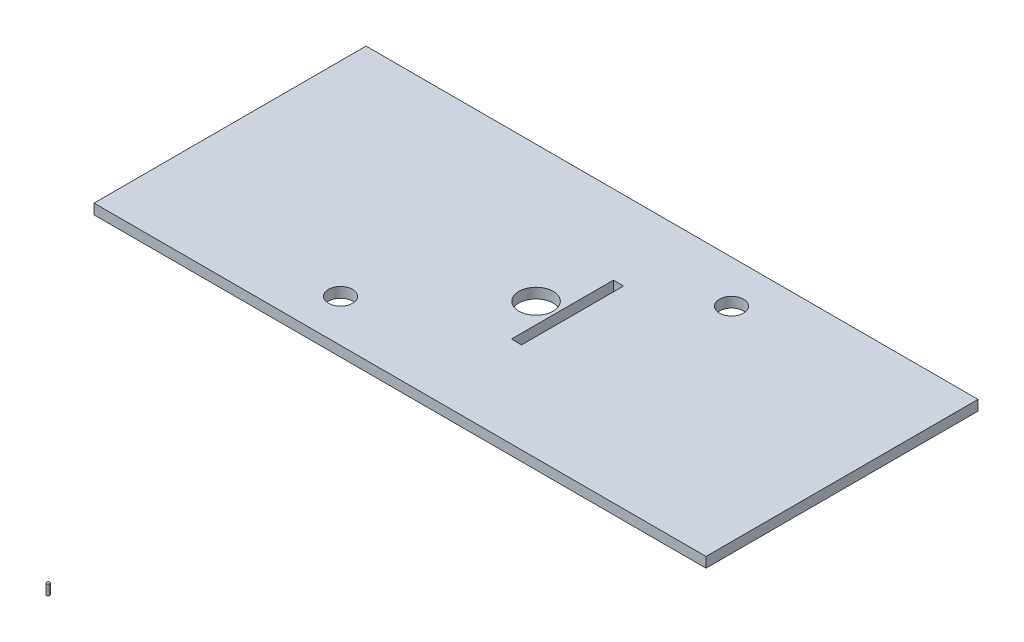
ISO-10303-21;
HEADER;
FILE_DESCRIPTION(('STEP AP214'),'2;1');
FILE_NAME('part.step','',(''),(''),'','','');
FILE_SCHEMA(('AUTOMOTIVE_DESIGN { 1 0 10303 214 1 1 1 1 }'));
ENDSEC;
DATA;
#1=APPLICATION_CONTEXT('core data for automotive mechanical design processes');
#2=APPLICATION_PROTOCOL_DEFINITION('international standard','automotive_design',2000,#1);
#3=PRODUCT_CONTEXT('',#1,'mechanical');
#4=PRODUCT('Part','Part','',(#3));
#5=PRODUCT_RELATED_PRODUCT_CATEGORY('part','',(#4));
#6=PRODUCT_DEFINITION_FORMATION('','',#4);
#7=PRODUCT_DEFINITION_CONTEXT('part definition',#1,'design');
#8=PRODUCT_DEFINITION('design','',#6,#7);
#9=PRODUCT_DEFINITION_SHAPE('','',#8);
#10=(LENGTH_UNIT() NAMED_UNIT(*) SI_UNIT(.MILLI.,.METRE.));
#11=(NAMED_UNIT(*) PLANE_ANGLE_UNIT() SI_UNIT($,.RADIAN.));
#12=(NAMED_UNIT(*) SI_UNIT($,.STERADIAN.) SOLID_ANGLE_UNIT());
#13=UNCERTAINTY_MEASURE_WITH_UNIT(LENGTH_MEASURE(1.E-05),#10,'distance_accuracy_value','');
#14=(GEOMETRIC_REPRESENTATION_CONTEXT(3) GLOBAL_UNCERTAINTY_ASSIGNED_CONTEXT((#13)) GLOBAL_UNIT_ASSIGNED_CONTEXT((#10,
#11,#12)) REPRESENTATION_CONTEXT('',''));
#15=CARTESIAN_POINT('',(0.,0.,0.));
#16=DIRECTION('',(0.,0.,1.));
#17=DIRECTION('',(1.,0.,0.));
#18=AXIS2_PLACEMENT_3D('',#15,#16,#17);
#19=CARTESIAN_POINT('',(0.,3.,143.5));
#20=DIRECTION('',(0.,-1.,0.));
#21=DIRECTION('',(0.,0.,-1.));
#22=AXIS2_PLACEMENT_3D('',#19,#20,#21);
#23=CYLINDRICAL_SURFACE('',#22,0.450000000000005);
#24=CARTESIAN_POINT('',(0.,3.,143.5));
#25=DIRECTION('',(0.,1.,0.));
#26=DIRECTION('',(0.,0.,1.));
#27=AXIS2_PLACEMENT_3D('',#24,#25,#26);
#28=CIRCLE('',#27,0.450000000000005);
#29=CARTESIAN_POINT('',(0.,3.,143.95));
#30=VERTEX_POINT('',#29);
#31=EDGE_CURVE('E57',#30,#30,#28,.T.);
#32=ORIENTED_EDGE('',*,*,#31,.F.);
#33=EDGE_LOOP('',(#32));
#34=FACE_BOUND('',#33,.T.);
#35=CARTESIAN_POINT('',(0.,0.,143.5));
#36=DIRECTION('',(0.,1.,0.));
#37=DIRECTION('',(0.,0.,1.));
#38=AXIS2_PLACEMENT_3D('',#35,#36,#37);
#39=CIRCLE('',#38,0.450000000000005);
#40=CARTESIAN_POINT('',(0.,0.,143.95));
#41=VERTEX_POINT('',#40);
#42=EDGE_CURVE('E11',#41,#41,#39,.T.);
#43=ORIENTED_EDGE('',*,*,#42,.T.);
#44=EDGE_LOOP('',(#43));
#45=FACE_BOUND('',#44,.T.);
#46=ADVANCED_FACE('F53',(#34,#45),#23,.T.);
#47=CARTESIAN_POINT('',(0.,3.,143.5));
#48=DIRECTION('',(0.,1.,0.));
#49=DIRECTION('',(0.,0.,1.));
#50=AXIS2_PLACEMENT_3D('',#47,#48,#49);
#51=PLANE('',#50);
#52=ORIENTED_EDGE('',*,*,#31,.T.);
#53=EDGE_LOOP('',(#52));
#54=FACE_BOUND('',#53,.T.);
#55=ADVANCED_FACE('F55',(#54),#51,.T.);
#56=CARTESIAN_POINT('',(0.,0.,143.5));
#57=DIRECTION('',(0.,1.,0.));
#58=DIRECTION('',(0.,0.,1.));
#59=AXIS2_PLACEMENT_3D('',#56,#57,#58);
#60=PLANE('',#59);
#61=ORIENTED_EDGE('',*,*,#42,.F.);
#62=EDGE_LOOP('',(#61));
#63=FACE_BOUND('',#62,.T.);
#64=ADVANCED_FACE('F72',(#63),#60,.F.);
#65=CLOSED_SHELL('',(#46,#55,#64));
#66=MANIFOLD_SOLID_BREP('B2',#65);
#67=CARTESIAN_POINT('',(0.,3.,0.));
#68=DIRECTION('',(0.,1.,0.));
#69=DIRECTION('',(0.,0.,1.));
#70=AXIS2_PLACEMENT_3D('',#67,#68,#69);
#71=PLANE('',#70);
#72=DIRECTION('',(0.,0.,-1.));
#73=VECTOR('',#72,1.);
#74=CARTESIAN_POINT('',(8.99999999999999,3.,-16.7480923361722));
#75=LINE('',#74,#73);
#76=CARTESIAN_POINT('',(9.00000000000001,3.,13.2519076638278));
#77=VERTEX_POINT('',#76);
#78=CARTESIAN_POINT('',(8.99999999999999,3.,-16.7480923361722));
#79=VERTEX_POINT('',#78);
#80=EDGE_CURVE('E110',#77,#79,#75,.T.);
#81=ORIENTED_EDGE('',*,*,#80,.F.);
#82=DIRECTION('',(1.,0.,0.));
#83=VECTOR('',#82,1.);
#84=CARTESIAN_POINT('',(6.,3.,13.2519076638278));
#85=LINE('',#84,#83);
#86=CARTESIAN_POINT('',(6.,3.,13.2519076638278));
#87=VERTEX_POINT('',#86);
#88=EDGE_CURVE('E180',#87,#77,#85,.T.);
#89=ORIENTED_EDGE('',*,*,#88,.F.);
#90=DIRECTION('',(0.,0.,1.));
#91=VECTOR('',#90,1.);
#92=CARTESIAN_POINT('',(5.99999999999999,3.,-16.7480923361722));
#93=LINE('',#92,#91);
#94=CARTESIAN_POINT('',(5.99999999999999,3.,-16.7480923361722));
#95=VERTEX_POINT('',#94);
#96=EDGE_CURVE('E163',#95,#87,#93,.T.);
#97=ORIENTED_EDGE('',*,*,#96,.F.);
#98=DIRECTION('',(-1.,0.,0.));
#99=VECTOR('',#98,1.);
#100=CARTESIAN_POINT('',(5.99999999999999,3.,-16.7480923361722));
#101=LINE('',#100,#99);
#102=EDGE_CURVE('E173',#79,#95,#101,.T.);
#103=ORIENTED_EDGE('',*,*,#102,.F.);
#104=EDGE_LOOP('',(#81,#89,#97,#103));
#105=FACE_BOUND('',#104,.T.);
#106=CARTESIAN_POINT('',(30.,3.,-27.5));
#107=DIRECTION('',(0.,1.,0.));
#108=DIRECTION('',(0.,0.,1.));
#109=AXIS2_PLACEMENT_3D('',#106,#107,#108);
#110=CIRCLE('',#109,3.55);
#111=CARTESIAN_POINT('',(30.,3.,-23.95));
#112=VERTEX_POINT('',#111);
#113=EDGE_CURVE('E195',#112,#112,#110,.T.);
#114=ORIENTED_EDGE('',*,*,#113,.F.);
#115=EDGE_LOOP('',(#114));
#116=FACE_BOUND('',#115,.T.);
#117=CARTESIAN_POINT('',(-30.,3.,27.5));
#118=DIRECTION('',(0.,1.,0.));
#119=DIRECTION('',(0.,0.,1.));
#120=AXIS2_PLACEMENT_3D('',#117,#118,#119);
#121=CIRCLE('',#120,3.55);
#122=CARTESIAN_POINT('',(-30.,3.,31.05));
#123=VERTEX_POINT('',#122);
#124=EDGE_CURVE('E190',#123,#123,#121,.T.);
#125=ORIENTED_EDGE('',*,*,#124,.F.);
#126=EDGE_LOOP('',(#125));
#127=FACE_BOUND('',#126,.T.);
#128=DIRECTION('',(0.,0.,1.));
#129=VECTOR('',#128,1.);
#130=CARTESIAN_POINT('',(-90.,3.,40.));
#131=LINE('',#130,#129);
#132=CARTESIAN_POINT('',(-90.,3.,-40.));
#133=VERTEX_POINT('',#132);
#134=CARTESIAN_POINT('',(-90.,3.,40.));
#135=VERTEX_POINT('',#134);
#136=EDGE_CURVE('E213',#133,#135,#131,.T.);
#137=ORIENTED_EDGE('',*,*,#136,.T.);
#138=DIRECTION('',(1.,0.,0.));
#139=VECTOR('',#138,1.);
#140=CARTESIAN_POINT('',(90.,3.,40.));
#141=LINE('',#140,#139);
#142=CARTESIAN_POINT('',(90.,3.,40.));
#143=VERTEX_POINT('',#142);
#144=EDGE_CURVE('E217',#135,#143,#141,.T.);
#145=ORIENTED_EDGE('',*,*,#144,.T.);
#146=DIRECTION('',(0.,0.,-1.));
#147=VECTOR('',#146,1.);
#148=CARTESIAN_POINT('',(90.,3.,40.));
#149=LINE('',#148,#147);
#150=CARTESIAN_POINT('',(90.,3.,-40.));
#151=VERTEX_POINT('',#150);
#152=EDGE_CURVE('E221',#143,#151,#149,.T.);
#153=ORIENTED_EDGE('',*,*,#152,.T.);
#154=DIRECTION('',(-1.,0.,0.));
#155=VECTOR('',#154,1.);
#156=CARTESIAN_POINT('',(90.,3.,-40.));
#157=LINE('',#156,#155);
#158=EDGE_CURVE('E224',#151,#133,#157,.T.);
#159=ORIENTED_EDGE('',*,*,#158,.T.);
#160=EDGE_LOOP('',(#137,#145,#153,#159));
#161=FACE_BOUND('',#160,.T.);
#162=CARTESIAN_POINT('',(0.,3.,0.));
#163=DIRECTION('',(0.,1.,0.));
#164=DIRECTION('',(0.,0.,1.));
#165=AXIS2_PLACEMENT_3D('',#162,#163,#164);
#166=CIRCLE('',#165,5.05);
#167=CARTESIAN_POINT('',(0.,3.,5.05));
#168=VERTEX_POINT('',#167);
#169=EDGE_CURVE('E203',#168,#168,#166,.T.);
#170=ORIENTED_EDGE('',*,*,#169,.F.);
#171=EDGE_LOOP('',(#170));
#172=FACE_BOUND('',#171,.T.);
#173=ADVANCED_FACE('F94',(#105,#116,#127,#161,#172),#71,.T.);
#174=CARTESIAN_POINT('',(0.,0.,0.));
#175=DIRECTION('',(0.,1.,0.));
#176=DIRECTION('',(0.,0.,1.));
#177=AXIS2_PLACEMENT_3D('',#174,#175,#176);
#178=PLANE('',#177);
#179=DIRECTION('',(1.,0.,0.));
#180=VECTOR('',#179,1.);
#181=CARTESIAN_POINT('',(0.,0.,13.2519076638278));
#182=LINE('',#181,#180);
#183=CARTESIAN_POINT('',(6.,0.,13.2519076638278));
#184=VERTEX_POINT('',#183);
#185=CARTESIAN_POINT('',(9.00000000000001,0.,13.2519076638278));
#186=VERTEX_POINT('',#185);
#187=EDGE_CURVE('E103',#184,#186,#182,.T.);
#188=ORIENTED_EDGE('',*,*,#187,.T.);
#189=DIRECTION('',(0.,0.,-1.));
#190=VECTOR('',#189,1.);
#191=CARTESIAN_POINT('',(9.,0.,0.));
#192=LINE('',#191,#190);
#193=CARTESIAN_POINT('',(8.99999999999999,0.,-16.7480923361722));
#194=VERTEX_POINT('',#193);
#195=EDGE_CURVE('E51',#186,#194,#192,.T.);
#196=ORIENTED_EDGE('',*,*,#195,.T.);
#197=DIRECTION('',(-1.,0.,0.));
#198=VECTOR('',#197,1.);
#199=CARTESIAN_POINT('',(0.,0.,-16.7480923361722));
#200=LINE('',#199,#198);
#201=CARTESIAN_POINT('',(5.99999999999999,0.,-16.7480923361722));
#202=VERTEX_POINT('',#201);
#203=EDGE_CURVE('E254',#194,#202,#200,.T.);
#204=ORIENTED_EDGE('',*,*,#203,.T.);
#205=DIRECTION('',(0.,0.,1.));
#206=VECTOR('',#205,1.);
#207=CARTESIAN_POINT('',(6.,0.,0.));
#208=LINE('',#207,#206);
#209=EDGE_CURVE('E166',#202,#184,#208,.T.);
#210=ORIENTED_EDGE('',*,*,#209,.T.);
#211=EDGE_LOOP('',(#188,#196,#204,#210));
#212=FACE_BOUND('',#211,.T.);
#213=CARTESIAN_POINT('',(30.,0.,-27.5));
#214=DIRECTION('',(0.,1.,0.));
#215=DIRECTION('',(0.,0.,1.));
#216=AXIS2_PLACEMENT_3D('',#213,#214,#215);
#217=CIRCLE('',#216,3.55);
#218=CARTESIAN_POINT('',(30.,0.,-23.95));
#219=VERTEX_POINT('',#218);
#220=EDGE_CURVE('E212',#219,#219,#217,.T.);
#221=ORIENTED_EDGE('',*,*,#220,.T.);
#222=EDGE_LOOP('',(#221));
#223=FACE_BOUND('',#222,.T.);
#224=CARTESIAN_POINT('',(-30.,0.,27.5));
#225=DIRECTION('',(0.,1.,0.));
#226=DIRECTION('',(0.,0.,1.));
#227=AXIS2_PLACEMENT_3D('',#224,#225,#226);
#228=CIRCLE('',#227,3.55);
#229=CARTESIAN_POINT('',(-30.,0.,31.05));
#230=VERTEX_POINT('',#229);
#231=EDGE_CURVE('E199',#230,#230,#228,.T.);
#232=ORIENTED_EDGE('',*,*,#231,.T.);
#233=EDGE_LOOP('',(#232));
#234=FACE_BOUND('',#233,.T.);
#235=DIRECTION('',(0.,0.,1.));
#236=VECTOR('',#235,1.);
#237=CARTESIAN_POINT('',(-90.,0.,40.));
#238=LINE('',#237,#236);
#239=CARTESIAN_POINT('',(-90.,0.,-40.));
#240=VERTEX_POINT('',#239);
#241=CARTESIAN_POINT('',(-90.,0.,40.));
#242=VERTEX_POINT('',#241);
#243=EDGE_CURVE('E207',#240,#242,#238,.T.);
#244=ORIENTED_EDGE('',*,*,#243,.F.);
#245=DIRECTION('',(-1.,0.,0.));
#246=VECTOR('',#245,1.);
#247=CARTESIAN_POINT('',(90.,0.,-40.));
#248=LINE('',#247,#246);
#249=CARTESIAN_POINT('',(90.,0.,-40.));
#250=VERTEX_POINT('',#249);
#251=EDGE_CURVE('E218',#250,#240,#248,.T.);
#252=ORIENTED_EDGE('',*,*,#251,.F.);
#253=DIRECTION('',(0.,0.,-1.));
#254=VECTOR('',#253,1.);
#255=CARTESIAN_POINT('',(90.,0.,40.));
#256=LINE('',#255,#254);
#257=CARTESIAN_POINT('',(90.,0.,40.));
#258=VERTEX_POINT('',#257);
#259=EDGE_CURVE('E234',#258,#250,#256,.T.);
#260=ORIENTED_EDGE('',*,*,#259,.F.);
#261=DIRECTION('',(1.,0.,0.));
#262=VECTOR('',#261,1.);
#263=CARTESIAN_POINT('',(90.,0.,40.));
#264=LINE('',#263,#262);
#265=EDGE_CURVE('E231',#242,#258,#264,.T.);
#266=ORIENTED_EDGE('',*,*,#265,.F.);
#267=EDGE_LOOP('',(#244,#252,#260,#266));
#268=FACE_BOUND('',#267,.T.);
#269=CARTESIAN_POINT('',(0.,0.,0.));
#270=DIRECTION('',(0.,1.,0.));
#271=DIRECTION('',(0.,0.,1.));
#272=AXIS2_PLACEMENT_3D('',#269,#270,#271);
#273=CIRCLE('',#272,5.05);
#274=CARTESIAN_POINT('',(0.,0.,5.05));
#275=VERTEX_POINT('',#274);
#276=EDGE_CURVE('E208',#275,#275,#273,.T.);
#277=ORIENTED_EDGE('',*,*,#276,.T.);
#278=EDGE_LOOP('',(#277));
#279=FACE_BOUND('',#278,.T.);
#280=ADVANCED_FACE('F267',(#212,#223,#234,#268,#279),#178,.F.);
#281=CARTESIAN_POINT('',(-90.,3.,40.));
#282=DIRECTION('',(1.,0.,0.));
#283=DIRECTION('',(0.,0.,-1.));
#284=AXIS2_PLACEMENT_3D('',#281,#282,#283);
#285=PLANE('',#284);
#286=ORIENTED_EDGE('',*,*,#243,.T.);
#287=DIRECTION('',(0.,-1.,0.));
#288=VECTOR('',#287,1.);
#289=CARTESIAN_POINT('',(-90.,3.,40.));
#290=LINE('',#289,#288);
#291=EDGE_CURVE('E250',#135,#242,#290,.T.);
#292=ORIENTED_EDGE('',*,*,#291,.F.);
#293=ORIENTED_EDGE('',*,*,#136,.F.);
#294=DIRECTION('',(0.,-1.,0.));
#295=VECTOR('',#294,1.);
#296=CARTESIAN_POINT('',(-90.,3.,-40.));
#297=LINE('',#296,#295);
#298=EDGE_CURVE('E227',#133,#240,#297,.T.);
#299=ORIENTED_EDGE('',*,*,#298,.T.);
#300=EDGE_LOOP('',(#286,#292,#293,#299));
#301=FACE_BOUND('',#300,.T.);
#302=ADVANCED_FACE('F96',(#301),#285,.F.);
#303=CARTESIAN_POINT('',(90.,3.,40.));
#304=DIRECTION('',(0.,0.,-1.));
#305=DIRECTION('',(-1.,0.,0.));
#306=AXIS2_PLACEMENT_3D('',#303,#304,#305);
#307=PLANE('',#306);
#308=ORIENTED_EDGE('',*,*,#265,.T.);
#309=DIRECTION('',(0.,-1.,0.));
#310=VECTOR('',#309,1.);
#311=CARTESIAN_POINT('',(90.,3.,40.));
#312=LINE('',#311,#310);
#313=EDGE_CURVE('E246',#143,#258,#312,.T.);
#314=ORIENTED_EDGE('',*,*,#313,.F.);
#315=ORIENTED_EDGE('',*,*,#144,.F.);
#316=ORIENTED_EDGE('',*,*,#291,.T.);
#317=EDGE_LOOP('',(#308,#314,#315,#316));
#318=FACE_BOUND('',#317,.T.);
#319=ADVANCED_FACE('F301',(#318),#307,.F.);
#320=CARTESIAN_POINT('',(90.,3.,40.));
#321=DIRECTION('',(-1.,0.,0.));
#322=DIRECTION('',(0.,0.,1.));
#323=AXIS2_PLACEMENT_3D('',#320,#321,#322);
#324=PLANE('',#323);
#325=ORIENTED_EDGE('',*,*,#259,.T.);
#326=DIRECTION('',(0.,-1.,0.));
#327=VECTOR('',#326,1.);
#328=CARTESIAN_POINT('',(90.,3.,-40.));
#329=LINE('',#328,#327);
#330=EDGE_CURVE('E242',#151,#250,#329,.T.);
#331=ORIENTED_EDGE('',*,*,#330,.F.);
#332=ORIENTED_EDGE('',*,*,#152,.F.);
#333=ORIENTED_EDGE('',*,*,#313,.T.);
#334=EDGE_LOOP('',(#325,#331,#332,#333));
#335=FACE_BOUND('',#334,.T.);
#336=ADVANCED_FACE('F298',(#335),#324,.F.);
#337=CARTESIAN_POINT('',(90.,3.,-40.));
#338=DIRECTION('',(0.,0.,1.));
#339=DIRECTION('',(1.,0.,0.));
#340=AXIS2_PLACEMENT_3D('',#337,#338,#339);
#341=PLANE('',#340);
#342=ORIENTED_EDGE('',*,*,#251,.T.);
#343=ORIENTED_EDGE('',*,*,#298,.F.);
#344=ORIENTED_EDGE('',*,*,#158,.F.);
#345=ORIENTED_EDGE('',*,*,#330,.T.);
#346=EDGE_LOOP('',(#342,#343,#344,#345));
#347=FACE_BOUND('',#346,.T.);
#348=ADVANCED_FACE('F295',(#347),#341,.F.);
#349=CARTESIAN_POINT('',(0.,3.,0.));
#350=DIRECTION('',(0.,-1.,0.));
#351=DIRECTION('',(0.,0.,-1.));
#352=AXIS2_PLACEMENT_3D('',#349,#350,#351);
#353=CYLINDRICAL_SURFACE('',#352,5.05);
#354=ORIENTED_EDGE('',*,*,#169,.T.);
#355=EDGE_LOOP('',(#354));
#356=FACE_BOUND('',#355,.T.);
#357=ORIENTED_EDGE('',*,*,#276,.F.);
#358=EDGE_LOOP('',(#357));
#359=FACE_BOUND('',#358,.T.);
#360=ADVANCED_FACE('F292',(#356,#359),#353,.F.);
#361=CARTESIAN_POINT('',(-30.,-97.,27.5));
#362=DIRECTION('',(0.,1.,0.));
#363=DIRECTION('',(0.,0.,1.));
#364=AXIS2_PLACEMENT_3D('',#361,#362,#363);
#365=CYLINDRICAL_SURFACE('',#364,3.55);
#366=ORIENTED_EDGE('',*,*,#124,.T.);
#367=EDGE_LOOP('',(#366));
#368=FACE_BOUND('',#367,.T.);
#369=ORIENTED_EDGE('',*,*,#231,.F.);
#370=EDGE_LOOP('',(#369));
#371=FACE_BOUND('',#370,.T.);
#372=ADVANCED_FACE('F282',(#368,#371),#365,.F.);
#373=CARTESIAN_POINT('',(30.,-97.,-27.5));
#374=DIRECTION('',(0.,1.,0.));
#375=DIRECTION('',(0.,0.,1.));
#376=AXIS2_PLACEMENT_3D('',#373,#374,#375);
#377=CYLINDRICAL_SURFACE('',#376,3.55);
#378=ORIENTED_EDGE('',*,*,#113,.T.);
#379=EDGE_LOOP('',(#378));
#380=FACE_BOUND('',#379,.T.);
#381=ORIENTED_EDGE('',*,*,#220,.F.);
#382=EDGE_LOOP('',(#381));
#383=FACE_BOUND('',#382,.T.);
#384=ADVANCED_FACE('F274',(#380,#383),#377,.F.);
#385=CARTESIAN_POINT('',(8.99999999999999,-7.,-16.7480923361722));
#386=DIRECTION('',(1.,0.,0.));
#387=DIRECTION('',(0.,0.,-1.));
#388=AXIS2_PLACEMENT_3D('',#385,#386,#387);
#389=PLANE('',#388);
#390=DIRECTION('',(0.,1.,0.));
#391=VECTOR('',#390,1.);
#392=CARTESIAN_POINT('',(9.00000000000001,-7.,13.2519076638278));
#393=LINE('',#392,#391);
#394=EDGE_CURVE('E187',#186,#77,#393,.T.);
#395=ORIENTED_EDGE('',*,*,#394,.T.);
#396=ORIENTED_EDGE('',*,*,#80,.T.);
#397=DIRECTION('',(0.,1.,0.));
#398=VECTOR('',#397,1.);
#399=CARTESIAN_POINT('',(8.99999999999999,-7.,-16.7480923361722));
#400=LINE('',#399,#398);
#401=EDGE_CURVE('E170',#194,#79,#400,.T.);
#402=ORIENTED_EDGE('',*,*,#401,.F.);
#403=ORIENTED_EDGE('',*,*,#195,.F.);
#404=EDGE_LOOP('',(#395,#396,#402,#403));
#405=FACE_BOUND('',#404,.T.);
#406=ADVANCED_FACE('F272',(#405),#389,.F.);
#407=CARTESIAN_POINT('',(6.,-7.,13.2519076638278));
#408=DIRECTION('',(0.,0.,1.));
#409=DIRECTION('',(1.,0.,0.));
#410=AXIS2_PLACEMENT_3D('',#407,#408,#409);
#411=PLANE('',#410);
#412=DIRECTION('',(0.,1.,0.));
#413=VECTOR('',#412,1.);
#414=CARTESIAN_POINT('',(6.,-7.,13.2519076638278));
#415=LINE('',#414,#413);
#416=EDGE_CURVE('E169',#184,#87,#415,.T.);
#417=ORIENTED_EDGE('',*,*,#416,.T.);
#418=ORIENTED_EDGE('',*,*,#88,.T.);
#419=ORIENTED_EDGE('',*,*,#394,.F.);
#420=ORIENTED_EDGE('',*,*,#187,.F.);
#421=EDGE_LOOP('',(#417,#418,#419,#420));
#422=FACE_BOUND('',#421,.T.);
#423=ADVANCED_FACE('F271',(#422),#411,.F.);
#424=CARTESIAN_POINT('',(5.99999999999999,-7.,-16.7480923361722));
#425=DIRECTION('',(-1.,0.,0.));
#426=DIRECTION('',(0.,0.,1.));
#427=AXIS2_PLACEMENT_3D('',#424,#425,#426);
#428=PLANE('',#427);
#429=DIRECTION('',(0.,1.,0.));
#430=VECTOR('',#429,1.);
#431=CARTESIAN_POINT('',(5.99999999999999,-7.,-16.7480923361722));
#432=LINE('',#431,#430);
#433=EDGE_CURVE('E118',#202,#95,#432,.T.);
#434=ORIENTED_EDGE('',*,*,#433,.T.);
#435=ORIENTED_EDGE('',*,*,#96,.T.);
#436=ORIENTED_EDGE('',*,*,#416,.F.);
#437=ORIENTED_EDGE('',*,*,#209,.F.);
#438=EDGE_LOOP('',(#434,#435,#436,#437));
#439=FACE_BOUND('',#438,.T.);
#440=ADVANCED_FACE('F160',(#439),#428,.F.);
#441=CARTESIAN_POINT('',(5.99999999999999,-7.,-16.7480923361722));
#442=DIRECTION('',(0.,0.,-1.));
#443=DIRECTION('',(-1.,0.,0.));
#444=AXIS2_PLACEMENT_3D('',#441,#442,#443);
#445=PLANE('',#444);
#446=ORIENTED_EDGE('',*,*,#401,.T.);
#447=ORIENTED_EDGE('',*,*,#102,.T.);
#448=ORIENTED_EDGE('',*,*,#433,.F.);
#449=ORIENTED_EDGE('',*,*,#203,.F.);
#450=EDGE_LOOP('',(#446,#447,#448,#449));
#451=FACE_BOUND('',#450,.T.);
#452=ADVANCED_FACE('F174',(#451),#445,.F.);
#453=CLOSED_SHELL('',(#173,#280,#302,#319,#336,#348,#360,#372,#384,#406,#423,#440,#452));
#454=MANIFOLD_SOLID_BREP('B6',#453);
#455=ADVANCED_BREP_SHAPE_REPRESENTATION('',(#18,#66,#454),#14);
#456=SHAPE_DEFINITION_REPRESENTATION(#9,#455);
ENDSEC;
END-ISO-10303-21;
